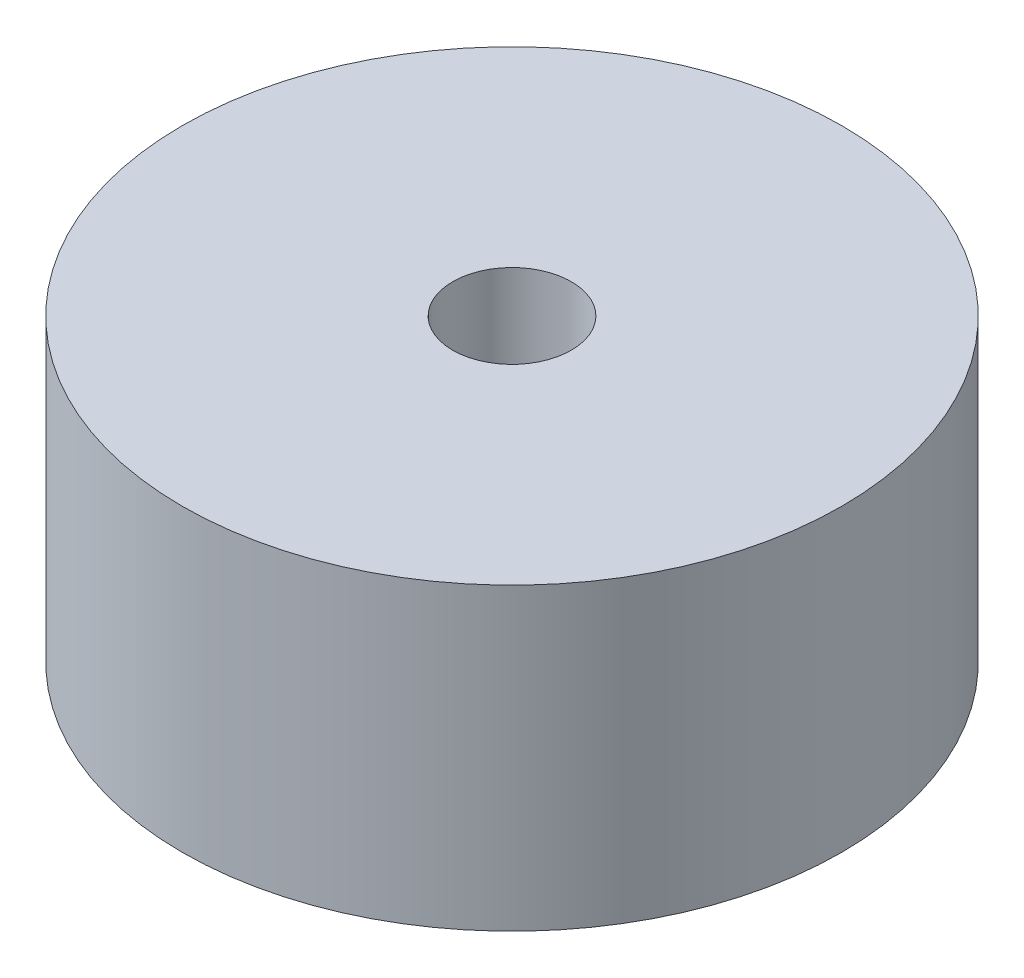
ISO-10303-21;
HEADER;
FILE_DESCRIPTION(('STEP AP214'),'2;1');
FILE_NAME('part.step','',(''),(''),'','','');
FILE_SCHEMA(('AUTOMOTIVE_DESIGN { 1 0 10303 214 1 1 1 1 }'));
ENDSEC;
DATA;
#1=APPLICATION_CONTEXT('core data for automotive mechanical design processes');
#2=APPLICATION_PROTOCOL_DEFINITION('international standard','automotive_design',2000,#1);
#3=PRODUCT_CONTEXT('',#1,'mechanical');
#4=PRODUCT('Part','Part','',(#3));
#5=PRODUCT_RELATED_PRODUCT_CATEGORY('part','',(#4));
#6=PRODUCT_DEFINITION_FORMATION('','',#4);
#7=PRODUCT_DEFINITION_CONTEXT('part definition',#1,'design');
#8=PRODUCT_DEFINITION('design','',#6,#7);
#9=PRODUCT_DEFINITION_SHAPE('','',#8);
#10=(LENGTH_UNIT() NAMED_UNIT(*) SI_UNIT(.MILLI.,.METRE.));
#11=(NAMED_UNIT(*) PLANE_ANGLE_UNIT() SI_UNIT($,.RADIAN.));
#12=(NAMED_UNIT(*) SI_UNIT($,.STERADIAN.) SOLID_ANGLE_UNIT());
#13=UNCERTAINTY_MEASURE_WITH_UNIT(LENGTH_MEASURE(1.E-05),#10,'distance_accuracy_value','');
#14=(GEOMETRIC_REPRESENTATION_CONTEXT(3) GLOBAL_UNCERTAINTY_ASSIGNED_CONTEXT((#13)) GLOBAL_UNIT_ASSIGNED_CONTEXT((#10,
#11,#12)) REPRESENTATION_CONTEXT('',''));
#15=CARTESIAN_POINT('',(0.,0.,0.));
#16=DIRECTION('',(0.,0.,1.));
#17=DIRECTION('',(1.,0.,0.));
#18=AXIS2_PLACEMENT_3D('',#15,#16,#17);
#19=CARTESIAN_POINT('',(0.,5.,0.));
#20=DIRECTION('',(0.,1.,0.));
#21=DIRECTION('',(0.,0.,1.));
#22=AXIS2_PLACEMENT_3D('',#19,#20,#21);
#23=PLANE('',#22);
#24=CARTESIAN_POINT('',(0.,5.,0.));
#25=DIRECTION('',(0.,1.,0.));
#26=DIRECTION('',(0.,0.,1.));
#27=AXIS2_PLACEMENT_3D('',#24,#25,#26);
#28=CIRCLE('',#27,5.5);
#29=CARTESIAN_POINT('',(0.,5.,5.5));
#30=VERTEX_POINT('',#29);
#31=EDGE_CURVE('E10',#30,#30,#28,.T.);
#32=ORIENTED_EDGE('',*,*,#31,.T.);
#33=EDGE_LOOP('',(#32));
#34=FACE_BOUND('',#33,.T.);
#35=CARTESIAN_POINT('',(0.,5.,0.));
#36=DIRECTION('',(0.,1.,0.));
#37=DIRECTION('',(0.,0.,1.));
#38=AXIS2_PLACEMENT_3D('',#35,#36,#37);
#39=CIRCLE('',#38,0.99);
#40=CARTESIAN_POINT('',(0.,5.,0.99));
#41=VERTEX_POINT('',#40);
#42=EDGE_CURVE('E42',#41,#41,#39,.T.);
#43=ORIENTED_EDGE('',*,*,#42,.F.);
#44=EDGE_LOOP('',(#43));
#45=FACE_BOUND('',#44,.T.);
#46=ADVANCED_FACE('F31',(#34,#45),#23,.T.);
#47=CARTESIAN_POINT('',(0.,0.,0.));
#48=DIRECTION('',(0.,1.,0.));
#49=DIRECTION('',(0.,0.,1.));
#50=AXIS2_PLACEMENT_3D('',#47,#48,#49);
#51=PLANE('',#50);
#52=CARTESIAN_POINT('',(0.,0.,0.));
#53=DIRECTION('',(0.,1.,0.));
#54=DIRECTION('',(0.,0.,1.));
#55=AXIS2_PLACEMENT_3D('',#52,#53,#54);
#56=CIRCLE('',#55,5.5);
#57=CARTESIAN_POINT('',(0.,0.,5.5));
#58=VERTEX_POINT('',#57);
#59=EDGE_CURVE('E35',#58,#58,#56,.T.);
#60=ORIENTED_EDGE('',*,*,#59,.F.);
#61=EDGE_LOOP('',(#60));
#62=FACE_BOUND('',#61,.T.);
#63=CARTESIAN_POINT('',(0.,0.,0.));
#64=DIRECTION('',(0.,1.,0.));
#65=DIRECTION('',(0.,0.,1.));
#66=AXIS2_PLACEMENT_3D('',#63,#64,#65);
#67=CIRCLE('',#66,0.99);
#68=CARTESIAN_POINT('',(0.,0.,0.99));
#69=VERTEX_POINT('',#68);
#70=EDGE_CURVE('E44',#69,#69,#67,.T.);
#71=ORIENTED_EDGE('',*,*,#70,.T.);
#72=EDGE_LOOP('',(#71));
#73=FACE_BOUND('',#72,.T.);
#74=ADVANCED_FACE('F54',(#62,#73),#51,.F.);
#75=CARTESIAN_POINT('',(0.,5.,0.));
#76=DIRECTION('',(0.,-1.,0.));
#77=DIRECTION('',(0.,0.,-1.));
#78=AXIS2_PLACEMENT_3D('',#75,#76,#77);
#79=CYLINDRICAL_SURFACE('',#78,5.5);
#80=ORIENTED_EDGE('',*,*,#31,.F.);
#81=EDGE_LOOP('',(#80));
#82=FACE_BOUND('',#81,.T.);
#83=ORIENTED_EDGE('',*,*,#59,.T.);
#84=EDGE_LOOP('',(#83));
#85=FACE_BOUND('',#84,.T.);
#86=ADVANCED_FACE('F33',(#82,#85),#79,.T.);
#87=CARTESIAN_POINT('',(0.,5.,0.));
#88=DIRECTION('',(0.,-1.,0.));
#89=DIRECTION('',(0.,0.,-1.));
#90=AXIS2_PLACEMENT_3D('',#87,#88,#89);
#91=CYLINDRICAL_SURFACE('',#90,0.99);
#92=ORIENTED_EDGE('',*,*,#42,.T.);
#93=EDGE_LOOP('',(#92));
#94=FACE_BOUND('',#93,.T.);
#95=ORIENTED_EDGE('',*,*,#70,.F.);
#96=EDGE_LOOP('',(#95));
#97=FACE_BOUND('',#96,.T.);
#98=ADVANCED_FACE('F50',(#94,#97),#91,.F.);
#99=CLOSED_SHELL('',(#46,#74,#86,#98));
#100=MANIFOLD_SOLID_BREP('B2',#99);
#101=ADVANCED_BREP_SHAPE_REPRESENTATION('',(#18,#100),#14);
#102=SHAPE_DEFINITION_REPRESENTATION(#9,#101);
ENDSEC;
END-ISO-10303-21;
